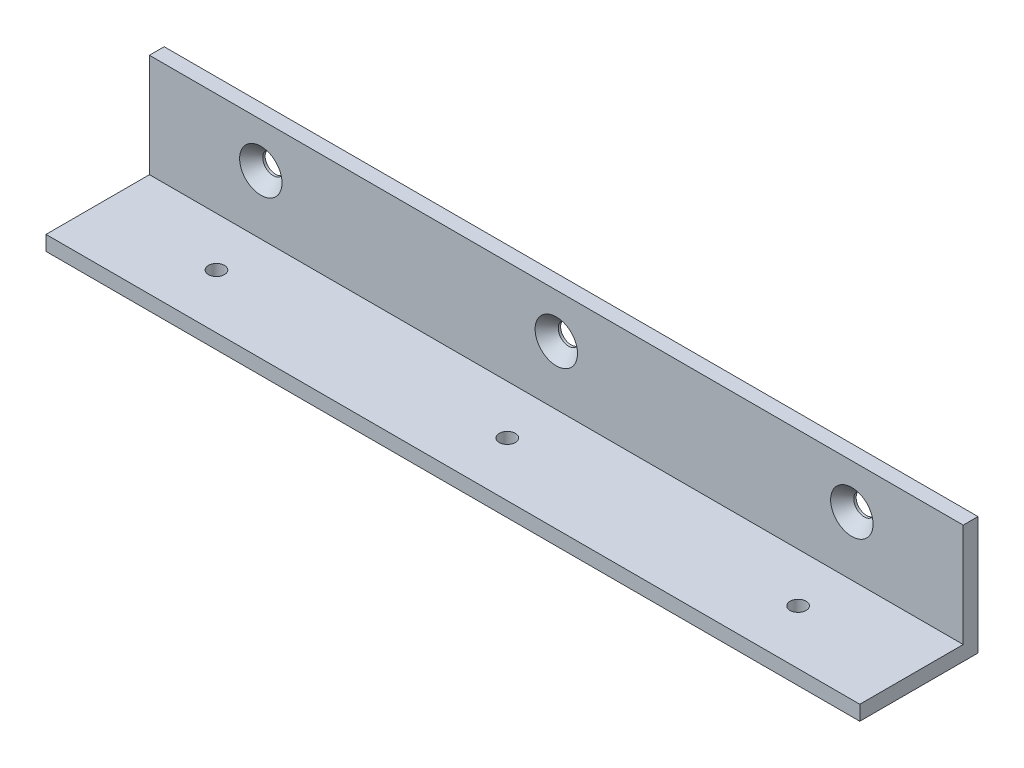
ISO-10303-21;
HEADER;
FILE_DESCRIPTION(('STEP AP214'),'2;1');
FILE_NAME('part.step','',(''),(''),'','','');
FILE_SCHEMA(('AUTOMOTIVE_DESIGN { 1 0 10303 214 1 1 1 1 }'));
ENDSEC;
DATA;
#1=APPLICATION_CONTEXT('core data for automotive mechanical design processes');
#2=APPLICATION_PROTOCOL_DEFINITION('international standard','automotive_design',2000,#1);
#3=PRODUCT_CONTEXT('',#1,'mechanical');
#4=PRODUCT('Part','Part','',(#3));
#5=PRODUCT_RELATED_PRODUCT_CATEGORY('part','',(#4));
#6=PRODUCT_DEFINITION_FORMATION('','',#4);
#7=PRODUCT_DEFINITION_CONTEXT('part definition',#1,'design');
#8=PRODUCT_DEFINITION('design','',#6,#7);
#9=PRODUCT_DEFINITION_SHAPE('','',#8);
#10=(LENGTH_UNIT() NAMED_UNIT(*) SI_UNIT(.MILLI.,.METRE.));
#11=(NAMED_UNIT(*) PLANE_ANGLE_UNIT() SI_UNIT($,.RADIAN.));
#12=(NAMED_UNIT(*) SI_UNIT($,.STERADIAN.) SOLID_ANGLE_UNIT());
#13=UNCERTAINTY_MEASURE_WITH_UNIT(LENGTH_MEASURE(1.E-05),#10,'distance_accuracy_value','');
#14=(GEOMETRIC_REPRESENTATION_CONTEXT(3) GLOBAL_UNCERTAINTY_ASSIGNED_CONTEXT((#13)) GLOBAL_UNIT_ASSIGNED_CONTEXT((#10,
#11,#12)) REPRESENTATION_CONTEXT('',''));
#15=CARTESIAN_POINT('',(0.,0.,0.));
#16=DIRECTION('',(0.,0.,1.));
#17=DIRECTION('',(1.,0.,0.));
#18=AXIS2_PLACEMENT_3D('',#15,#16,#17);
#19=CARTESIAN_POINT('',(87.4395,3.175,-12.7));
#20=DIRECTION('',(0.,-1.,0.));
#21=DIRECTION('',(0.,0.,-1.));
#22=AXIS2_PLACEMENT_3D('',#19,#20,#21);
#23=PLANE('',#22);
#24=CARTESIAN_POINT('',(-62.5,3.175,1.016));
#25=DIRECTION('',(0.,1.,0.));
#26=DIRECTION('',(0.,0.,1.));
#27=AXIS2_PLACEMENT_3D('',#24,#25,#26);
#28=CIRCLE('',#27,1.7272);
#29=CARTESIAN_POINT('',(-62.5,3.175,2.7432));
#30=VERTEX_POINT('',#29);
#31=EDGE_CURVE('E142',#30,#30,#28,.T.);
#32=ORIENTED_EDGE('',*,*,#31,.F.);
#33=EDGE_LOOP('',(#32));
#34=FACE_BOUND('',#33,.T.);
#35=CARTESIAN_POINT('',(0.,3.175,1.01599999999999));
#36=DIRECTION('',(0.,1.,0.));
#37=DIRECTION('',(0.,0.,1.));
#38=AXIS2_PLACEMENT_3D('',#35,#36,#37);
#39=CIRCLE('',#38,1.7272);
#40=CARTESIAN_POINT('',(0.,3.175,2.74319999999999));
#41=VERTEX_POINT('',#40);
#42=EDGE_CURVE('E132',#41,#41,#39,.T.);
#43=ORIENTED_EDGE('',*,*,#42,.F.);
#44=EDGE_LOOP('',(#43));
#45=FACE_BOUND('',#44,.T.);
#46=CARTESIAN_POINT('',(62.5,3.175,1.01599999999998));
#47=DIRECTION('',(0.,1.,0.));
#48=DIRECTION('',(0.,0.,1.));
#49=AXIS2_PLACEMENT_3D('',#46,#47,#48);
#50=CIRCLE('',#49,1.7272);
#51=CARTESIAN_POINT('',(62.5,3.175,2.74319999999998));
#52=VERTEX_POINT('',#51);
#53=EDGE_CURVE('E131',#52,#52,#50,.T.);
#54=ORIENTED_EDGE('',*,*,#53,.F.);
#55=EDGE_LOOP('',(#54));
#56=FACE_BOUND('',#55,.T.);
#57=DIRECTION('',(1.,0.,0.));
#58=VECTOR('',#57,1.);
#59=CARTESIAN_POINT('',(-87.4395,3.175,-9.525));
#60=LINE('',#59,#58);
#61=CARTESIAN_POINT('',(-87.4395,3.175,-9.525));
#62=VERTEX_POINT('',#61);
#63=CARTESIAN_POINT('',(87.4395,3.175,-9.525));
#64=VERTEX_POINT('',#63);
#65=EDGE_CURVE('E52',#62,#64,#60,.T.);
#66=ORIENTED_EDGE('',*,*,#65,.F.);
#67=DIRECTION('',(0.,0.,1.));
#68=VECTOR('',#67,1.);
#69=CARTESIAN_POINT('',(-87.4395,3.175,12.7));
#70=LINE('',#69,#68);
#71=CARTESIAN_POINT('',(-87.4395,3.175,12.7));
#72=VERTEX_POINT('',#71);
#73=EDGE_CURVE('E113',#62,#72,#70,.T.);
#74=ORIENTED_EDGE('',*,*,#73,.T.);
#75=DIRECTION('',(1.,0.,0.));
#76=VECTOR('',#75,1.);
#77=CARTESIAN_POINT('',(-87.4395,3.175,12.7));
#78=LINE('',#77,#76);
#79=CARTESIAN_POINT('',(87.4395,3.175,12.7));
#80=VERTEX_POINT('',#79);
#81=EDGE_CURVE('E58',#72,#80,#78,.T.);
#82=ORIENTED_EDGE('',*,*,#81,.T.);
#83=DIRECTION('',(0.,0.,-1.));
#84=VECTOR('',#83,1.);
#85=CARTESIAN_POINT('',(87.4395,3.175,12.7));
#86=LINE('',#85,#84);
#87=EDGE_CURVE('E87',#80,#64,#86,.T.);
#88=ORIENTED_EDGE('',*,*,#87,.T.);
#89=EDGE_LOOP('',(#66,#74,#82,#88));
#90=FACE_BOUND('',#89,.T.);
#91=ADVANCED_FACE('F35',(#34,#45,#56,#90),#23,.F.);
#92=CARTESIAN_POINT('',(87.4395,3.175,12.7));
#93=DIRECTION('',(-1.,0.,0.));
#94=DIRECTION('',(0.,0.,1.));
#95=AXIS2_PLACEMENT_3D('',#92,#93,#94);
#96=PLANE('',#95);
#97=DIRECTION('',(0.,0.,-1.));
#98=VECTOR('',#97,1.);
#99=CARTESIAN_POINT('',(87.4395,0.,12.7));
#100=LINE('',#99,#98);
#101=CARTESIAN_POINT('',(87.4395,0.,12.7));
#102=VERTEX_POINT('',#101);
#103=CARTESIAN_POINT('',(87.4395,0.,-12.7));
#104=VERTEX_POINT('',#103);
#105=EDGE_CURVE('E93',#102,#104,#100,.T.);
#106=ORIENTED_EDGE('',*,*,#105,.T.);
#107=DIRECTION('',(0.,-1.,0.));
#108=VECTOR('',#107,1.);
#109=CARTESIAN_POINT('',(87.4395,3.175,-12.7));
#110=LINE('',#109,#108);
#111=CARTESIAN_POINT('',(87.4395,25.4,-12.7));
#112=VERTEX_POINT('',#111);
#113=EDGE_CURVE('E11',#112,#104,#110,.T.);
#114=ORIENTED_EDGE('',*,*,#113,.F.);
#115=DIRECTION('',(0.,0.,-1.));
#116=VECTOR('',#115,1.);
#117=CARTESIAN_POINT('',(87.4395,25.4,-12.7));
#118=LINE('',#117,#116);
#119=CARTESIAN_POINT('',(87.4395,25.4,-9.525));
#120=VERTEX_POINT('',#119);
#121=EDGE_CURVE('E152',#120,#112,#118,.T.);
#122=ORIENTED_EDGE('',*,*,#121,.F.);
#123=DIRECTION('',(0.,-1.,0.));
#124=VECTOR('',#123,1.);
#125=CARTESIAN_POINT('',(87.4395,25.4,-9.525));
#126=LINE('',#125,#124);
#127=EDGE_CURVE('E102',#120,#64,#126,.T.);
#128=ORIENTED_EDGE('',*,*,#127,.T.);
#129=ORIENTED_EDGE('',*,*,#87,.F.);
#130=DIRECTION('',(0.,-1.,0.));
#131=VECTOR('',#130,1.);
#132=CARTESIAN_POINT('',(87.4395,3.175,12.7));
#133=LINE('',#132,#131);
#134=EDGE_CURVE('E80',#80,#102,#133,.T.);
#135=ORIENTED_EDGE('',*,*,#134,.T.);
#136=EDGE_LOOP('',(#106,#114,#122,#128,#129,#135));
#137=FACE_BOUND('',#136,.T.);
#138=ADVANCED_FACE('F37',(#137),#96,.F.);
#139=CARTESIAN_POINT('',(-87.4395,3.175,-12.7));
#140=DIRECTION('',(0.,0.,1.));
#141=DIRECTION('',(1.,0.,0.));
#142=AXIS2_PLACEMENT_3D('',#139,#140,#141);
#143=PLANE('',#142);
#144=CARTESIAN_POINT('',(-63.5,15.875,-12.7));
#145=DIRECTION('',(0.,0.,1.));
#146=DIRECTION('',(1.,0.,0.));
#147=AXIS2_PLACEMENT_3D('',#144,#145,#146);
#148=CIRCLE('',#147,2.2479);
#149=CARTESIAN_POINT('',(-61.2521,15.875,-12.7));
#150=VERTEX_POINT('',#149);
#151=EDGE_CURVE('E204',#150,#150,#148,.T.);
#152=ORIENTED_EDGE('',*,*,#151,.T.);
#153=EDGE_LOOP('',(#152));
#154=FACE_BOUND('',#153,.T.);
#155=CARTESIAN_POINT('',(0.,15.875,-12.7));
#156=DIRECTION('',(0.,0.,1.));
#157=DIRECTION('',(1.,0.,0.));
#158=AXIS2_PLACEMENT_3D('',#155,#156,#157);
#159=CIRCLE('',#158,2.2479);
#160=CARTESIAN_POINT('',(2.2479,15.875,-12.7));
#161=VERTEX_POINT('',#160);
#162=EDGE_CURVE('E208',#161,#161,#159,.T.);
#163=ORIENTED_EDGE('',*,*,#162,.T.);
#164=EDGE_LOOP('',(#163));
#165=FACE_BOUND('',#164,.T.);
#166=CARTESIAN_POINT('',(63.5,15.875,-12.7));
#167=DIRECTION('',(0.,0.,1.));
#168=DIRECTION('',(1.,0.,0.));
#169=AXIS2_PLACEMENT_3D('',#166,#167,#168);
#170=CIRCLE('',#169,2.2479);
#171=CARTESIAN_POINT('',(65.7479,15.875,-12.7));
#172=VERTEX_POINT('',#171);
#173=EDGE_CURVE('E211',#172,#172,#170,.T.);
#174=ORIENTED_EDGE('',*,*,#173,.T.);
#175=EDGE_LOOP('',(#174));
#176=FACE_BOUND('',#175,.T.);
#177=DIRECTION('',(-1.,0.,0.));
#178=VECTOR('',#177,1.);
#179=CARTESIAN_POINT('',(-87.4395,0.,-12.7));
#180=LINE('',#179,#178);
#181=CARTESIAN_POINT('',(-87.4395,0.,-12.7));
#182=VERTEX_POINT('',#181);
#183=EDGE_CURVE('E97',#104,#182,#180,.T.);
#184=ORIENTED_EDGE('',*,*,#183,.T.);
#185=DIRECTION('',(0.,-1.,0.));
#186=VECTOR('',#185,1.);
#187=CARTESIAN_POINT('',(-87.4395,3.175,-12.7));
#188=LINE('',#187,#186);
#189=CARTESIAN_POINT('',(-87.4395,25.4,-12.7));
#190=VERTEX_POINT('',#189);
#191=EDGE_CURVE('E44',#190,#182,#188,.T.);
#192=ORIENTED_EDGE('',*,*,#191,.F.);
#193=DIRECTION('',(-1.,0.,0.));
#194=VECTOR('',#193,1.);
#195=CARTESIAN_POINT('',(-87.4395,25.4,-12.7));
#196=LINE('',#195,#194);
#197=EDGE_CURVE('E120',#112,#190,#196,.T.);
#198=ORIENTED_EDGE('',*,*,#197,.F.);
#199=ORIENTED_EDGE('',*,*,#113,.T.);
#200=EDGE_LOOP('',(#184,#192,#198,#199));
#201=FACE_BOUND('',#200,.T.);
#202=ADVANCED_FACE('F183',(#154,#165,#176,#201),#143,.F.);
#203=CARTESIAN_POINT('',(-87.4395,3.175,12.7));
#204=DIRECTION('',(1.,0.,0.));
#205=DIRECTION('',(0.,0.,-1.));
#206=AXIS2_PLACEMENT_3D('',#203,#204,#205);
#207=PLANE('',#206);
#208=DIRECTION('',(0.,0.,1.));
#209=VECTOR('',#208,1.);
#210=CARTESIAN_POINT('',(-87.4395,0.,12.7));
#211=LINE('',#210,#209);
#212=CARTESIAN_POINT('',(-87.4395,0.,12.7));
#213=VERTEX_POINT('',#212);
#214=EDGE_CURVE('E88',#182,#213,#211,.T.);
#215=ORIENTED_EDGE('',*,*,#214,.T.);
#216=DIRECTION('',(0.,-1.,0.));
#217=VECTOR('',#216,1.);
#218=CARTESIAN_POINT('',(-87.4395,3.175,12.7));
#219=LINE('',#218,#217);
#220=EDGE_CURVE('E83',#72,#213,#219,.T.);
#221=ORIENTED_EDGE('',*,*,#220,.F.);
#222=ORIENTED_EDGE('',*,*,#73,.F.);
#223=DIRECTION('',(0.,-1.,0.));
#224=VECTOR('',#223,1.);
#225=CARTESIAN_POINT('',(-87.4395,25.4,-9.525));
#226=LINE('',#225,#224);
#227=CARTESIAN_POINT('',(-87.4395,25.4,-9.525));
#228=VERTEX_POINT('',#227);
#229=EDGE_CURVE('E98',#228,#62,#226,.T.);
#230=ORIENTED_EDGE('',*,*,#229,.F.);
#231=DIRECTION('',(0.,0.,1.));
#232=VECTOR('',#231,1.);
#233=CARTESIAN_POINT('',(-87.4395,25.4,-12.7));
#234=LINE('',#233,#232);
#235=EDGE_CURVE('E123',#190,#228,#234,.T.);
#236=ORIENTED_EDGE('',*,*,#235,.F.);
#237=ORIENTED_EDGE('',*,*,#191,.T.);
#238=EDGE_LOOP('',(#215,#221,#222,#230,#236,#237));
#239=FACE_BOUND('',#238,.T.);
#240=ADVANCED_FACE('F167',(#239),#207,.F.);
#241=CARTESIAN_POINT('',(-87.4395,3.175,12.7));
#242=DIRECTION('',(0.,0.,-1.));
#243=DIRECTION('',(-1.,0.,0.));
#244=AXIS2_PLACEMENT_3D('',#241,#242,#243);
#245=PLANE('',#244);
#246=DIRECTION('',(1.,0.,0.));
#247=VECTOR('',#246,1.);
#248=CARTESIAN_POINT('',(-87.4395,0.,12.7));
#249=LINE('',#248,#247);
#250=EDGE_CURVE('E77',#213,#102,#249,.T.);
#251=ORIENTED_EDGE('',*,*,#250,.T.);
#252=ORIENTED_EDGE('',*,*,#134,.F.);
#253=ORIENTED_EDGE('',*,*,#81,.F.);
#254=ORIENTED_EDGE('',*,*,#220,.T.);
#255=EDGE_LOOP('',(#251,#252,#253,#254));
#256=FACE_BOUND('',#255,.T.);
#257=ADVANCED_FACE('F79',(#256),#245,.F.);
#258=CARTESIAN_POINT('',(87.4395,0.,-12.7));
#259=DIRECTION('',(0.,-1.,0.));
#260=DIRECTION('',(0.,0.,-1.));
#261=AXIS2_PLACEMENT_3D('',#258,#259,#260);
#262=PLANE('',#261);
#263=CARTESIAN_POINT('',(-62.5,0.,1.016));
#264=DIRECTION('',(0.,-1.,0.));
#265=DIRECTION('',(0.,0.,-1.));
#266=AXIS2_PLACEMENT_3D('',#263,#264,#265);
#267=CIRCLE('',#266,1.7272);
#268=CARTESIAN_POINT('',(-62.5,0.,-0.711199999999999));
#269=VERTEX_POINT('',#268);
#270=EDGE_CURVE('E39',#269,#269,#267,.T.);
#271=ORIENTED_EDGE('',*,*,#270,.F.);
#272=EDGE_LOOP('',(#271));
#273=FACE_BOUND('',#272,.T.);
#274=CARTESIAN_POINT('',(0.,0.,1.01599999999999));
#275=DIRECTION('',(0.,-1.,0.));
#276=DIRECTION('',(0.,0.,-1.));
#277=AXIS2_PLACEMENT_3D('',#274,#275,#276);
#278=CIRCLE('',#277,1.7272);
#279=CARTESIAN_POINT('',(0.,0.,-0.711200000000006));
#280=VERTEX_POINT('',#279);
#281=EDGE_CURVE('E129',#280,#280,#278,.T.);
#282=ORIENTED_EDGE('',*,*,#281,.F.);
#283=EDGE_LOOP('',(#282));
#284=FACE_BOUND('',#283,.T.);
#285=CARTESIAN_POINT('',(62.5,0.,1.01599999999998));
#286=DIRECTION('',(0.,-1.,0.));
#287=DIRECTION('',(0.,0.,-1.));
#288=AXIS2_PLACEMENT_3D('',#285,#286,#287);
#289=CIRCLE('',#288,1.7272);
#290=CARTESIAN_POINT('',(62.5,0.,-0.711200000000014));
#291=VERTEX_POINT('',#290);
#292=EDGE_CURVE('E124',#291,#291,#289,.T.);
#293=ORIENTED_EDGE('',*,*,#292,.F.);
#294=EDGE_LOOP('',(#293));
#295=FACE_BOUND('',#294,.T.);
#296=ORIENTED_EDGE('',*,*,#105,.F.);
#297=ORIENTED_EDGE('',*,*,#250,.F.);
#298=ORIENTED_EDGE('',*,*,#214,.F.);
#299=ORIENTED_EDGE('',*,*,#183,.F.);
#300=EDGE_LOOP('',(#296,#297,#298,#299));
#301=FACE_BOUND('',#300,.T.);
#302=ADVANCED_FACE('F96',(#273,#284,#295,#301),#262,.T.);
#303=CARTESIAN_POINT('',(-87.4395,25.4,-9.525));
#304=DIRECTION('',(0.,0.,-1.));
#305=DIRECTION('',(-1.,0.,0.));
#306=AXIS2_PLACEMENT_3D('',#303,#304,#305);
#307=PLANE('',#306);
#308=CARTESIAN_POINT('',(-63.5,15.875,-9.525));
#309=DIRECTION('',(0.,0.,1.));
#310=DIRECTION('',(1.,0.,0.));
#311=AXIS2_PLACEMENT_3D('',#308,#309,#310);
#312=CIRCLE('',#311,4.5593);
#313=CARTESIAN_POINT('',(-58.9407,15.875,-9.525));
#314=VERTEX_POINT('',#313);
#315=EDGE_CURVE('E232',#314,#314,#312,.T.);
#316=ORIENTED_EDGE('',*,*,#315,.F.);
#317=EDGE_LOOP('',(#316));
#318=FACE_BOUND('',#317,.T.);
#319=CARTESIAN_POINT('',(0.,15.875,-9.525));
#320=DIRECTION('',(0.,0.,1.));
#321=DIRECTION('',(1.,0.,0.));
#322=AXIS2_PLACEMENT_3D('',#319,#320,#321);
#323=CIRCLE('',#322,4.5593);
#324=CARTESIAN_POINT('',(4.5593,15.875,-9.525));
#325=VERTEX_POINT('',#324);
#326=EDGE_CURVE('E225',#325,#325,#323,.T.);
#327=ORIENTED_EDGE('',*,*,#326,.F.);
#328=EDGE_LOOP('',(#327));
#329=FACE_BOUND('',#328,.T.);
#330=CARTESIAN_POINT('',(63.5,15.875,-9.525));
#331=DIRECTION('',(0.,0.,1.));
#332=DIRECTION('',(1.,0.,0.));
#333=AXIS2_PLACEMENT_3D('',#330,#331,#332);
#334=CIRCLE('',#333,4.5593);
#335=CARTESIAN_POINT('',(68.0593,15.875,-9.525));
#336=VERTEX_POINT('',#335);
#337=EDGE_CURVE('E216',#336,#336,#334,.T.);
#338=ORIENTED_EDGE('',*,*,#337,.F.);
#339=EDGE_LOOP('',(#338));
#340=FACE_BOUND('',#339,.T.);
#341=ORIENTED_EDGE('',*,*,#65,.T.);
#342=ORIENTED_EDGE('',*,*,#127,.F.);
#343=DIRECTION('',(1.,0.,0.));
#344=VECTOR('',#343,1.);
#345=CARTESIAN_POINT('',(-87.4395,25.4,-9.525));
#346=LINE('',#345,#344);
#347=EDGE_CURVE('E150',#228,#120,#346,.T.);
#348=ORIENTED_EDGE('',*,*,#347,.F.);
#349=ORIENTED_EDGE('',*,*,#229,.T.);
#350=EDGE_LOOP('',(#341,#342,#348,#349));
#351=FACE_BOUND('',#350,.T.);
#352=ADVANCED_FACE('F173',(#318,#329,#340,#351),#307,.F.);
#353=CARTESIAN_POINT('',(-87.4395,25.4,-9.525));
#354=DIRECTION('',(0.,1.,0.));
#355=DIRECTION('',(0.,0.,1.));
#356=AXIS2_PLACEMENT_3D('',#353,#354,#355);
#357=PLANE('',#356);
#358=ORIENTED_EDGE('',*,*,#235,.T.);
#359=ORIENTED_EDGE('',*,*,#347,.T.);
#360=ORIENTED_EDGE('',*,*,#121,.T.);
#361=ORIENTED_EDGE('',*,*,#197,.T.);
#362=EDGE_LOOP('',(#358,#359,#360,#361));
#363=FACE_BOUND('',#362,.T.);
#364=ADVANCED_FACE('F160',(#363),#357,.T.);
#365=CARTESIAN_POINT('',(62.5,3.175,1.01599999999998));
#366=DIRECTION('',(0.,1.,0.));
#367=DIRECTION('',(0.,0.,1.));
#368=AXIS2_PLACEMENT_3D('',#365,#366,#367);
#369=CYLINDRICAL_SURFACE('',#368,1.7272);
#370=ORIENTED_EDGE('',*,*,#292,.T.);
#371=EDGE_LOOP('',(#370));
#372=FACE_BOUND('',#371,.T.);
#373=ORIENTED_EDGE('',*,*,#53,.T.);
#374=EDGE_LOOP('',(#373));
#375=FACE_BOUND('',#374,.T.);
#376=ADVANCED_FACE('F267',(#372,#375),#369,.F.);
#377=CARTESIAN_POINT('',(0.,3.175,1.01599999999999));
#378=DIRECTION('',(0.,1.,0.));
#379=DIRECTION('',(0.,0.,1.));
#380=AXIS2_PLACEMENT_3D('',#377,#378,#379);
#381=CYLINDRICAL_SURFACE('',#380,1.7272);
#382=ORIENTED_EDGE('',*,*,#281,.T.);
#383=EDGE_LOOP('',(#382));
#384=FACE_BOUND('',#383,.T.);
#385=ORIENTED_EDGE('',*,*,#42,.T.);
#386=EDGE_LOOP('',(#385));
#387=FACE_BOUND('',#386,.T.);
#388=ADVANCED_FACE('F263',(#384,#387),#381,.F.);
#389=CARTESIAN_POINT('',(-62.5,3.175,1.016));
#390=DIRECTION('',(0.,1.,0.));
#391=DIRECTION('',(0.,0.,1.));
#392=AXIS2_PLACEMENT_3D('',#389,#390,#391);
#393=CYLINDRICAL_SURFACE('',#392,1.7272);
#394=ORIENTED_EDGE('',*,*,#270,.T.);
#395=EDGE_LOOP('',(#394));
#396=FACE_BOUND('',#395,.T.);
#397=ORIENTED_EDGE('',*,*,#31,.T.);
#398=EDGE_LOOP('',(#397));
#399=FACE_BOUND('',#398,.T.);
#400=ADVANCED_FACE('F256',(#396,#399),#393,.F.);
#401=CARTESIAN_POINT('',(63.5,15.875,-9.525));
#402=DIRECTION('',(0.,0.,1.));
#403=DIRECTION('',(1.,0.,0.));
#404=AXIS2_PLACEMENT_3D('',#401,#402,#403);
#405=CYLINDRICAL_SURFACE('',#404,2.2479);
#406=ORIENTED_EDGE('',*,*,#173,.F.);
#407=EDGE_LOOP('',(#406));
#408=FACE_BOUND('',#407,.T.);
#409=CARTESIAN_POINT('',(63.5,15.875,-12.1839615364506));
#410=DIRECTION('',(0.,0.,1.));
#411=DIRECTION('',(1.,0.,0.));
#412=AXIS2_PLACEMENT_3D('',#409,#410,#411);
#413=CIRCLE('',#412,2.2479);
#414=CARTESIAN_POINT('',(65.7479,15.875,-12.1839615364506));
#415=VERTEX_POINT('',#414);
#416=EDGE_CURVE('E213',#415,#415,#413,.T.);
#417=ORIENTED_EDGE('',*,*,#416,.T.);
#418=EDGE_LOOP('',(#417));
#419=FACE_BOUND('',#418,.T.);
#420=ADVANCED_FACE('F246',(#408,#419),#405,.F.);
#421=CARTESIAN_POINT('',(63.5,15.875,-9.525));
#422=DIRECTION('',(0.,0.,1.));
#423=DIRECTION('',(1.,0.,0.));
#424=AXIS2_PLACEMENT_3D('',#421,#422,#423);
#425=CONICAL_SURFACE('',#424,4.5593,0.715584993317676);
#426=ORIENTED_EDGE('',*,*,#416,.F.);
#427=EDGE_LOOP('',(#426));
#428=FACE_BOUND('',#427,.T.);
#429=ORIENTED_EDGE('',*,*,#337,.T.);
#430=EDGE_LOOP('',(#429));
#431=FACE_BOUND('',#430,.T.);
#432=ADVANCED_FACE('F243',(#428,#431),#425,.F.);
#433=CARTESIAN_POINT('',(0.,15.875,-9.525));
#434=DIRECTION('',(0.,0.,1.));
#435=DIRECTION('',(1.,0.,0.));
#436=AXIS2_PLACEMENT_3D('',#433,#434,#435);
#437=CYLINDRICAL_SURFACE('',#436,2.2479);
#438=ORIENTED_EDGE('',*,*,#162,.F.);
#439=EDGE_LOOP('',(#438));
#440=FACE_BOUND('',#439,.T.);
#441=CARTESIAN_POINT('',(0.,15.875,-12.1839615364506));
#442=DIRECTION('',(0.,0.,1.));
#443=DIRECTION('',(1.,0.,0.));
#444=AXIS2_PLACEMENT_3D('',#441,#442,#443);
#445=CIRCLE('',#444,2.2479);
#446=CARTESIAN_POINT('',(2.2479,15.875,-12.1839615364506));
#447=VERTEX_POINT('',#446);
#448=EDGE_CURVE('E222',#447,#447,#445,.T.);
#449=ORIENTED_EDGE('',*,*,#448,.T.);
#450=EDGE_LOOP('',(#449));
#451=FACE_BOUND('',#450,.T.);
#452=ADVANCED_FACE('F245',(#440,#451),#437,.F.);
#453=CARTESIAN_POINT('',(0.,15.875,-9.525));
#454=DIRECTION('',(0.,0.,1.));
#455=DIRECTION('',(1.,0.,0.));
#456=AXIS2_PLACEMENT_3D('',#453,#454,#455);
#457=CONICAL_SURFACE('',#456,4.5593,0.715584993317675);
#458=ORIENTED_EDGE('',*,*,#448,.F.);
#459=EDGE_LOOP('',(#458));
#460=FACE_BOUND('',#459,.T.);
#461=ORIENTED_EDGE('',*,*,#326,.T.);
#462=EDGE_LOOP('',(#461));
#463=FACE_BOUND('',#462,.T.);
#464=ADVANCED_FACE('F253',(#460,#463),#457,.F.);
#465=CARTESIAN_POINT('',(-63.5,15.875,-9.525));
#466=DIRECTION('',(0.,0.,1.));
#467=DIRECTION('',(1.,0.,0.));
#468=AXIS2_PLACEMENT_3D('',#465,#466,#467);
#469=CYLINDRICAL_SURFACE('',#468,2.2479);
#470=ORIENTED_EDGE('',*,*,#151,.F.);
#471=EDGE_LOOP('',(#470));
#472=FACE_BOUND('',#471,.T.);
#473=CARTESIAN_POINT('',(-63.5,15.875,-12.1839615364506));
#474=DIRECTION('',(0.,0.,1.));
#475=DIRECTION('',(1.,0.,0.));
#476=AXIS2_PLACEMENT_3D('',#473,#474,#475);
#477=CIRCLE('',#476,2.2479);
#478=CARTESIAN_POINT('',(-61.2521,15.875,-12.1839615364506));
#479=VERTEX_POINT('',#478);
#480=EDGE_CURVE('E229',#479,#479,#477,.T.);
#481=ORIENTED_EDGE('',*,*,#480,.T.);
#482=EDGE_LOOP('',(#481));
#483=FACE_BOUND('',#482,.T.);
#484=ADVANCED_FACE('F313',(#472,#483),#469,.F.);
#485=CARTESIAN_POINT('',(-63.5,15.875,-9.525));
#486=DIRECTION('',(0.,0.,1.));
#487=DIRECTION('',(1.,0.,0.));
#488=AXIS2_PLACEMENT_3D('',#485,#486,#487);
#489=CONICAL_SURFACE('',#488,4.5593,0.715584993317676);
#490=ORIENTED_EDGE('',*,*,#480,.F.);
#491=EDGE_LOOP('',(#490));
#492=FACE_BOUND('',#491,.T.);
#493=ORIENTED_EDGE('',*,*,#315,.T.);
#494=EDGE_LOOP('',(#493));
#495=FACE_BOUND('',#494,.T.);
#496=ADVANCED_FACE('F236',(#492,#495),#489,.F.);
#497=CLOSED_SHELL('',(#91,#138,#202,#240,#257,#302,#352,#364,#376,#388,#400,#420,#432,#452,#464,
#484,#496));
#498=MANIFOLD_SOLID_BREP('B2',#497);
#499=ADVANCED_BREP_SHAPE_REPRESENTATION('',(#18,#498),#14);
#500=SHAPE_DEFINITION_REPRESENTATION(#9,#499);
ENDSEC;
END-ISO-10303-21;
